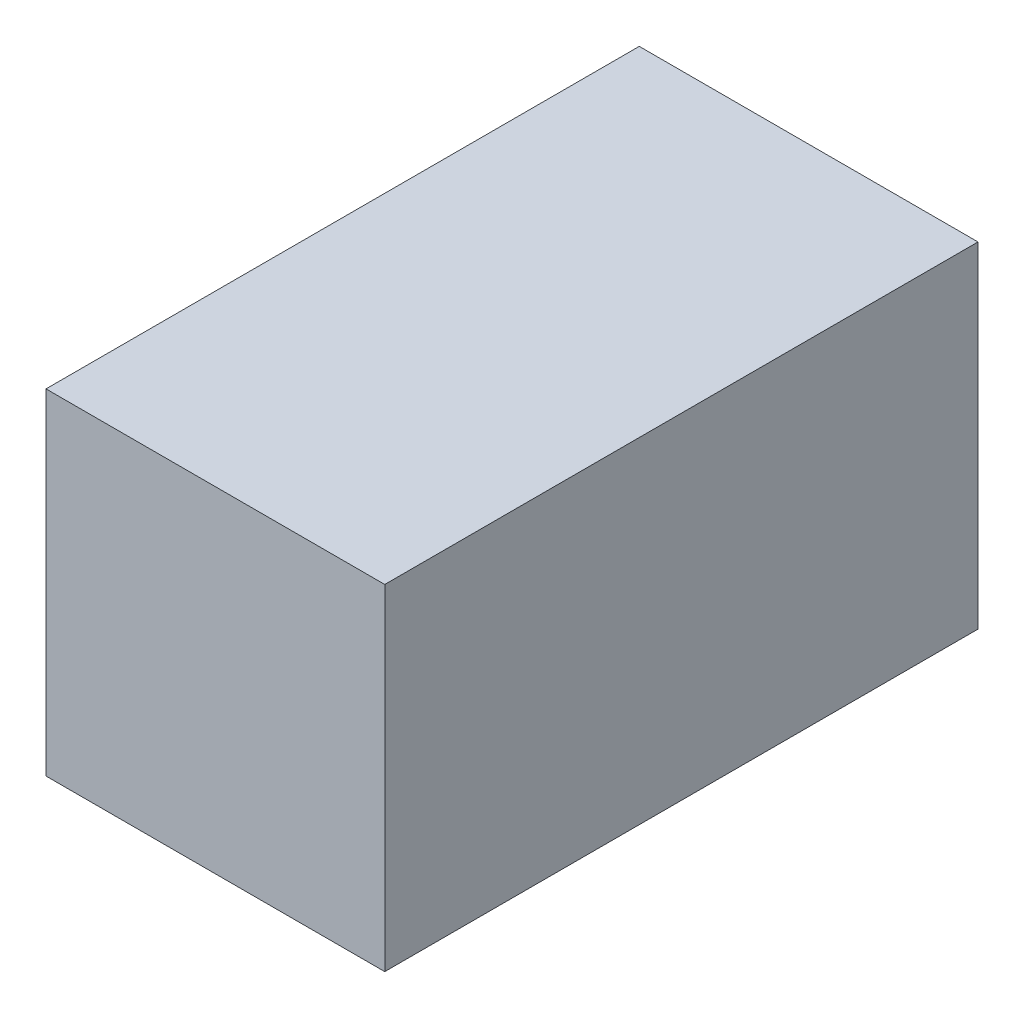
ISO-10303-21;
HEADER;
FILE_DESCRIPTION(('STEP AP214'),'2;1');
FILE_NAME('part.step','',(''),(''),'','','');
FILE_SCHEMA(('AUTOMOTIVE_DESIGN { 1 0 10303 214 1 1 1 1 }'));
ENDSEC;
DATA;
#1=APPLICATION_CONTEXT('core data for automotive mechanical design processes');
#2=APPLICATION_PROTOCOL_DEFINITION('international standard','automotive_design',2000,#1);
#3=PRODUCT_CONTEXT('',#1,'mechanical');
#4=PRODUCT('Part','Part','',(#3));
#5=PRODUCT_RELATED_PRODUCT_CATEGORY('part','',(#4));
#6=PRODUCT_DEFINITION_FORMATION('','',#4);
#7=PRODUCT_DEFINITION_CONTEXT('part definition',#1,'design');
#8=PRODUCT_DEFINITION('design','',#6,#7);
#9=PRODUCT_DEFINITION_SHAPE('','',#8);
#10=(LENGTH_UNIT() NAMED_UNIT(*) SI_UNIT(.MILLI.,.METRE.));
#11=(NAMED_UNIT(*) PLANE_ANGLE_UNIT() SI_UNIT($,.RADIAN.));
#12=(NAMED_UNIT(*) SI_UNIT($,.STERADIAN.) SOLID_ANGLE_UNIT());
#13=UNCERTAINTY_MEASURE_WITH_UNIT(LENGTH_MEASURE(1.E-05),#10,'distance_accuracy_value','');
#14=(GEOMETRIC_REPRESENTATION_CONTEXT(3) GLOBAL_UNCERTAINTY_ASSIGNED_CONTEXT((#13)) GLOBAL_UNIT_ASSIGNED_CONTEXT((#10,
#11,#12)) REPRESENTATION_CONTEXT('',''));
#15=CARTESIAN_POINT('',(0.,0.,0.));
#16=DIRECTION('',(0.,0.,1.));
#17=DIRECTION('',(1.,0.,0.));
#18=AXIS2_PLACEMENT_3D('',#15,#16,#17);
#19=CARTESIAN_POINT('',(7.4676,5.0038,17.526));
#20=DIRECTION('',(-1.,0.,0.));
#21=DIRECTION('',(0.,0.,1.));
#22=AXIS2_PLACEMENT_3D('',#19,#20,#21);
#23=PLANE('',#22);
#24=DIRECTION('',(0.,1.,0.));
#25=VECTOR('',#24,1.);
#26=CARTESIAN_POINT('',(7.4676,5.0038,0.));
#27=LINE('',#26,#25);
#28=CARTESIAN_POINT('',(7.4676,-4.9022,0.));
#29=VERTEX_POINT('',#28);
#30=CARTESIAN_POINT('',(7.4676,5.0038,0.));
#31=VERTEX_POINT('',#30);
#32=EDGE_CURVE('E95',#29,#31,#27,.T.);
#33=ORIENTED_EDGE('',*,*,#32,.T.);
#34=DIRECTION('',(0.,0.,-1.));
#35=VECTOR('',#34,1.);
#36=CARTESIAN_POINT('',(7.4676,5.0038,17.526));
#37=LINE('',#36,#35);
#38=CARTESIAN_POINT('',(7.4676,5.0038,17.526));
#39=VERTEX_POINT('',#38);
#40=EDGE_CURVE('E11',#39,#31,#37,.T.);
#41=ORIENTED_EDGE('',*,*,#40,.F.);
#42=DIRECTION('',(0.,1.,0.));
#43=VECTOR('',#42,1.);
#44=CARTESIAN_POINT('',(7.4676,5.0038,17.526));
#45=LINE('',#44,#43);
#46=CARTESIAN_POINT('',(7.4676,-4.9022,17.526));
#47=VERTEX_POINT('',#46);
#48=EDGE_CURVE('E83',#47,#39,#45,.T.);
#49=ORIENTED_EDGE('',*,*,#48,.F.);
#50=DIRECTION('',(0.,0.,-1.));
#51=VECTOR('',#50,1.);
#52=CARTESIAN_POINT('',(7.4676,-4.9022,17.526));
#53=LINE('',#52,#51);
#54=EDGE_CURVE('E91',#47,#29,#53,.T.);
#55=ORIENTED_EDGE('',*,*,#54,.T.);
#56=EDGE_LOOP('',(#33,#41,#49,#55));
#57=FACE_BOUND('',#56,.T.);
#58=ADVANCED_FACE('F32',(#57),#23,.F.);
#59=CARTESIAN_POINT('',(-2.54,5.0038,17.526));
#60=DIRECTION('',(0.,-1.,0.));
#61=DIRECTION('',(0.,0.,-1.));
#62=AXIS2_PLACEMENT_3D('',#59,#60,#61);
#63=PLANE('',#62);
#64=DIRECTION('',(-1.,0.,0.));
#65=VECTOR('',#64,1.);
#66=CARTESIAN_POINT('',(-2.54,5.0038,0.));
#67=LINE('',#66,#65);
#68=CARTESIAN_POINT('',(-2.54,5.0038,0.));
#69=VERTEX_POINT('',#68);
#70=EDGE_CURVE('E87',#31,#69,#67,.T.);
#71=ORIENTED_EDGE('',*,*,#70,.T.);
#72=DIRECTION('',(0.,0.,-1.));
#73=VECTOR('',#72,1.);
#74=CARTESIAN_POINT('',(-2.54,5.0038,17.526));
#75=LINE('',#74,#73);
#76=CARTESIAN_POINT('',(-2.54,5.0038,17.526));
#77=VERTEX_POINT('',#76);
#78=EDGE_CURVE('E40',#77,#69,#75,.T.);
#79=ORIENTED_EDGE('',*,*,#78,.F.);
#80=DIRECTION('',(-1.,0.,0.));
#81=VECTOR('',#80,1.);
#82=CARTESIAN_POINT('',(-2.54,5.0038,17.526));
#83=LINE('',#82,#81);
#84=EDGE_CURVE('E78',#39,#77,#83,.T.);
#85=ORIENTED_EDGE('',*,*,#84,.F.);
#86=ORIENTED_EDGE('',*,*,#40,.T.);
#87=EDGE_LOOP('',(#71,#79,#85,#86));
#88=FACE_BOUND('',#87,.T.);
#89=ADVANCED_FACE('F86',(#88),#63,.F.);
#90=CARTESIAN_POINT('',(-2.54,-4.9022,17.526));
#91=DIRECTION('',(1.,0.,0.));
#92=DIRECTION('',(0.,0.,-1.));
#93=AXIS2_PLACEMENT_3D('',#90,#91,#92);
#94=PLANE('',#93);
#95=DIRECTION('',(0.,-1.,0.));
#96=VECTOR('',#95,1.);
#97=CARTESIAN_POINT('',(-2.54,-4.9022,0.));
#98=LINE('',#97,#96);
#99=CARTESIAN_POINT('',(-2.54,-4.9022,0.));
#100=VERTEX_POINT('',#99);
#101=EDGE_CURVE('E65',#69,#100,#98,.T.);
#102=ORIENTED_EDGE('',*,*,#101,.T.);
#103=DIRECTION('',(0.,0.,-1.));
#104=VECTOR('',#103,1.);
#105=CARTESIAN_POINT('',(-2.54,-4.9022,17.526));
#106=LINE('',#105,#104);
#107=CARTESIAN_POINT('',(-2.54,-4.9022,17.526));
#108=VERTEX_POINT('',#107);
#109=EDGE_CURVE('E88',#108,#100,#106,.T.);
#110=ORIENTED_EDGE('',*,*,#109,.F.);
#111=DIRECTION('',(0.,-1.,0.));
#112=VECTOR('',#111,1.);
#113=CARTESIAN_POINT('',(-2.54,-4.9022,17.526));
#114=LINE('',#113,#112);
#115=EDGE_CURVE('E81',#77,#108,#114,.T.);
#116=ORIENTED_EDGE('',*,*,#115,.F.);
#117=ORIENTED_EDGE('',*,*,#78,.T.);
#118=EDGE_LOOP('',(#102,#110,#116,#117));
#119=FACE_BOUND('',#118,.T.);
#120=ADVANCED_FACE('F89',(#119),#94,.F.);
#121=CARTESIAN_POINT('',(7.4676,-4.9022,17.526));
#122=DIRECTION('',(0.,1.,0.));
#123=DIRECTION('',(0.,0.,1.));
#124=AXIS2_PLACEMENT_3D('',#121,#122,#123);
#125=PLANE('',#124);
#126=DIRECTION('',(1.,0.,0.));
#127=VECTOR('',#126,1.);
#128=CARTESIAN_POINT('',(7.4676,-4.9022,0.));
#129=LINE('',#128,#127);
#130=EDGE_CURVE('E71',#100,#29,#129,.T.);
#131=ORIENTED_EDGE('',*,*,#130,.T.);
#132=ORIENTED_EDGE('',*,*,#54,.F.);
#133=DIRECTION('',(1.,0.,0.));
#134=VECTOR('',#133,1.);
#135=CARTESIAN_POINT('',(7.4676,-4.9022,17.526));
#136=LINE('',#135,#134);
#137=EDGE_CURVE('E48',#108,#47,#136,.T.);
#138=ORIENTED_EDGE('',*,*,#137,.F.);
#139=ORIENTED_EDGE('',*,*,#109,.T.);
#140=EDGE_LOOP('',(#131,#132,#138,#139));
#141=FACE_BOUND('',#140,.T.);
#142=ADVANCED_FACE('F102',(#141),#125,.F.);
#143=CARTESIAN_POINT('',(0.,0.,17.526));
#144=DIRECTION('',(0.,0.,-1.));
#145=DIRECTION('',(-1.,0.,0.));
#146=AXIS2_PLACEMENT_3D('',#143,#144,#145);
#147=PLANE('',#146);
#148=ORIENTED_EDGE('',*,*,#48,.T.);
#149=ORIENTED_EDGE('',*,*,#84,.T.);
#150=ORIENTED_EDGE('',*,*,#115,.T.);
#151=ORIENTED_EDGE('',*,*,#137,.T.);
#152=EDGE_LOOP('',(#148,#149,#150,#151));
#153=FACE_BOUND('',#152,.T.);
#154=ADVANCED_FACE('F79',(#153),#147,.F.);
#155=CARTESIAN_POINT('',(0.,0.,0.));
#156=DIRECTION('',(0.,0.,-1.));
#157=DIRECTION('',(-1.,0.,0.));
#158=AXIS2_PLACEMENT_3D('',#155,#156,#157);
#159=PLANE('',#158);
#160=ORIENTED_EDGE('',*,*,#32,.F.);
#161=ORIENTED_EDGE('',*,*,#130,.F.);
#162=ORIENTED_EDGE('',*,*,#101,.F.);
#163=ORIENTED_EDGE('',*,*,#70,.F.);
#164=EDGE_LOOP('',(#160,#161,#162,#163));
#165=FACE_BOUND('',#164,.T.);
#166=ADVANCED_FACE('F105',(#165),#159,.T.);
#167=CLOSED_SHELL('',(#58,#89,#120,#142,#154,#166));
#168=MANIFOLD_SOLID_BREP('B2',#167);
#169=ADVANCED_BREP_SHAPE_REPRESENTATION('',(#18,#168),#14);
#170=SHAPE_DEFINITION_REPRESENTATION(#9,#169);
ENDSEC;
END-ISO-10303-21;
